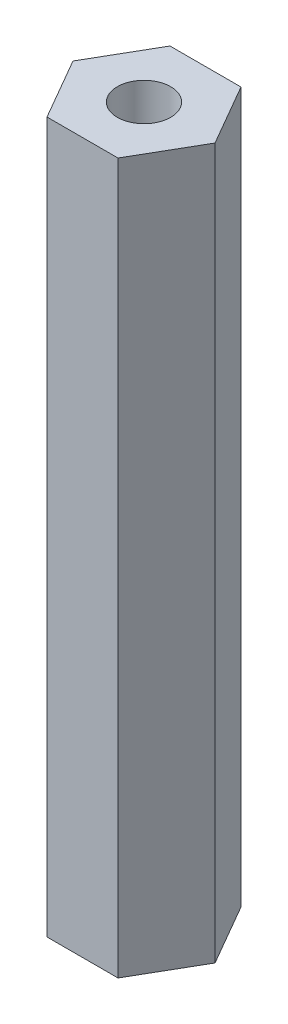
ISO-10303-21;
HEADER;
FILE_DESCRIPTION(('STEP AP214'),'2;1');
FILE_NAME('part.step','',(''),(''),'','','');
FILE_SCHEMA(('AUTOMOTIVE_DESIGN { 1 0 10303 214 1 1 1 1 }'));
ENDSEC;
DATA;
#1=APPLICATION_CONTEXT('core data for automotive mechanical design processes');
#2=APPLICATION_PROTOCOL_DEFINITION('international standard','automotive_design',2000,#1);
#3=PRODUCT_CONTEXT('',#1,'mechanical');
#4=PRODUCT('Part','Part','',(#3));
#5=PRODUCT_RELATED_PRODUCT_CATEGORY('part','',(#4));
#6=PRODUCT_DEFINITION_FORMATION('','',#4);
#7=PRODUCT_DEFINITION_CONTEXT('part definition',#1,'design');
#8=PRODUCT_DEFINITION('design','',#6,#7);
#9=PRODUCT_DEFINITION_SHAPE('','',#8);
#10=(LENGTH_UNIT() NAMED_UNIT(*) SI_UNIT(.MILLI.,.METRE.));
#11=(NAMED_UNIT(*) PLANE_ANGLE_UNIT() SI_UNIT($,.RADIAN.));
#12=(NAMED_UNIT(*) SI_UNIT($,.STERADIAN.) SOLID_ANGLE_UNIT());
#13=UNCERTAINTY_MEASURE_WITH_UNIT(LENGTH_MEASURE(1.E-05),#10,'distance_accuracy_value','');
#14=(GEOMETRIC_REPRESENTATION_CONTEXT(3) GLOBAL_UNCERTAINTY_ASSIGNED_CONTEXT((#13)) GLOBAL_UNIT_ASSIGNED_CONTEXT((#10,
#11,#12)) REPRESENTATION_CONTEXT('',''));
#15=CARTESIAN_POINT('',(0.,0.,0.));
#16=DIRECTION('',(0.,0.,1.));
#17=DIRECTION('',(1.,0.,0.));
#18=AXIS2_PLACEMENT_3D('',#15,#16,#17);
#19=CARTESIAN_POINT('',(-2.,40.,-3.46410161513776));
#20=DIRECTION('',(0.866025403784438,0.,0.5));
#21=DIRECTION('',(0.5,0.,-0.866025403784438));
#22=AXIS2_PLACEMENT_3D('',#19,#20,#21);
#23=PLANE('',#22);
#24=DIRECTION('',(-0.5,0.,0.866025403784438));
#25=VECTOR('',#24,1.);
#26=CARTESIAN_POINT('',(-2.,0.,-3.46410161513776));
#27=LINE('',#26,#25);
#28=CARTESIAN_POINT('',(-2.,0.,-3.46410161513776));
#29=VERTEX_POINT('',#28);
#30=CARTESIAN_POINT('',(-4.,0.,0.));
#31=VERTEX_POINT('',#30);
#32=EDGE_CURVE('E118',#29,#31,#27,.T.);
#33=ORIENTED_EDGE('',*,*,#32,.T.);
#34=DIRECTION('',(0.,-1.,0.));
#35=VECTOR('',#34,1.);
#36=CARTESIAN_POINT('',(-4.,40.,0.));
#37=LINE('',#36,#35);
#38=CARTESIAN_POINT('',(-4.,40.,0.));
#39=VERTEX_POINT('',#38);
#40=EDGE_CURVE('E11',#39,#31,#37,.T.);
#41=ORIENTED_EDGE('',*,*,#40,.F.);
#42=DIRECTION('',(-0.5,0.,0.866025403784438));
#43=VECTOR('',#42,1.);
#44=CARTESIAN_POINT('',(-2.,40.,-3.46410161513776));
#45=LINE('',#44,#43);
#46=CARTESIAN_POINT('',(-2.,40.,-3.46410161513776));
#47=VERTEX_POINT('',#46);
#48=EDGE_CURVE('E129',#47,#39,#45,.T.);
#49=ORIENTED_EDGE('',*,*,#48,.F.);
#50=DIRECTION('',(0.,-1.,0.));
#51=VECTOR('',#50,1.);
#52=CARTESIAN_POINT('',(-2.,40.,-3.46410161513776));
#53=LINE('',#52,#51);
#54=EDGE_CURVE('E114',#47,#29,#53,.T.);
#55=ORIENTED_EDGE('',*,*,#54,.T.);
#56=EDGE_LOOP('',(#33,#41,#49,#55));
#57=FACE_BOUND('',#56,.T.);
#58=ADVANCED_FACE('F34',(#57),#23,.F.);
#59=CARTESIAN_POINT('',(-4.,40.,0.));
#60=DIRECTION('',(0.866025403784438,0.,-0.5));
#61=DIRECTION('',(-0.5,0.,-0.866025403784439));
#62=AXIS2_PLACEMENT_3D('',#59,#60,#61);
#63=PLANE('',#62);
#64=DIRECTION('',(0.5,0.,0.866025403784439));
#65=VECTOR('',#64,1.);
#66=CARTESIAN_POINT('',(-4.,0.,0.));
#67=LINE('',#66,#65);
#68=CARTESIAN_POINT('',(-2.,0.,3.46410161513776));
#69=VERTEX_POINT('',#68);
#70=EDGE_CURVE('E121',#31,#69,#67,.T.);
#71=ORIENTED_EDGE('',*,*,#70,.T.);
#72=DIRECTION('',(0.,-1.,0.));
#73=VECTOR('',#72,1.);
#74=CARTESIAN_POINT('',(-2.,40.,3.46410161513776));
#75=LINE('',#74,#73);
#76=CARTESIAN_POINT('',(-2.,40.,3.46410161513776));
#77=VERTEX_POINT('',#76);
#78=EDGE_CURVE('E42',#77,#69,#75,.T.);
#79=ORIENTED_EDGE('',*,*,#78,.F.);
#80=DIRECTION('',(0.5,0.,0.866025403784439));
#81=VECTOR('',#80,1.);
#82=CARTESIAN_POINT('',(-4.,40.,0.));
#83=LINE('',#82,#81);
#84=EDGE_CURVE('E87',#39,#77,#83,.T.);
#85=ORIENTED_EDGE('',*,*,#84,.F.);
#86=ORIENTED_EDGE('',*,*,#40,.T.);
#87=EDGE_LOOP('',(#71,#79,#85,#86));
#88=FACE_BOUND('',#87,.T.);
#89=ADVANCED_FACE('F154',(#88),#63,.F.);
#90=CARTESIAN_POINT('',(-2.,40.,3.46410161513776));
#91=DIRECTION('',(0.,0.,-1.));
#92=DIRECTION('',(-1.,0.,0.));
#93=AXIS2_PLACEMENT_3D('',#90,#91,#92);
#94=PLANE('',#93);
#95=DIRECTION('',(1.,0.,0.));
#96=VECTOR('',#95,1.);
#97=CARTESIAN_POINT('',(-2.,0.,3.46410161513776));
#98=LINE('',#97,#96);
#99=CARTESIAN_POINT('',(2.,0.,3.46410161513776));
#100=VERTEX_POINT('',#99);
#101=EDGE_CURVE('E124',#69,#100,#98,.T.);
#102=ORIENTED_EDGE('',*,*,#101,.T.);
#103=DIRECTION('',(0.,-1.,0.));
#104=VECTOR('',#103,1.);
#105=CARTESIAN_POINT('',(2.,40.,3.46410161513776));
#106=LINE('',#105,#104);
#107=CARTESIAN_POINT('',(2.,40.,3.46410161513776));
#108=VERTEX_POINT('',#107);
#109=EDGE_CURVE('E109',#108,#100,#106,.T.);
#110=ORIENTED_EDGE('',*,*,#109,.F.);
#111=DIRECTION('',(1.,0.,0.));
#112=VECTOR('',#111,1.);
#113=CARTESIAN_POINT('',(-2.,40.,3.46410161513776));
#114=LINE('',#113,#112);
#115=EDGE_CURVE('E100',#77,#108,#114,.T.);
#116=ORIENTED_EDGE('',*,*,#115,.F.);
#117=ORIENTED_EDGE('',*,*,#78,.T.);
#118=EDGE_LOOP('',(#102,#110,#116,#117));
#119=FACE_BOUND('',#118,.T.);
#120=ADVANCED_FACE('F135',(#119),#94,.F.);
#121=CARTESIAN_POINT('',(2.,40.,3.46410161513776));
#122=DIRECTION('',(-0.866025403784438,0.,-0.5));
#123=DIRECTION('',(-0.5,0.,0.866025403784438));
#124=AXIS2_PLACEMENT_3D('',#121,#122,#123);
#125=PLANE('',#124);
#126=DIRECTION('',(0.5,0.,-0.866025403784438));
#127=VECTOR('',#126,1.);
#128=CARTESIAN_POINT('',(2.,0.,3.46410161513776));
#129=LINE('',#128,#127);
#130=CARTESIAN_POINT('',(4.,0.,0.));
#131=VERTEX_POINT('',#130);
#132=EDGE_CURVE('E108',#100,#131,#129,.T.);
#133=ORIENTED_EDGE('',*,*,#132,.T.);
#134=DIRECTION('',(0.,-1.,0.));
#135=VECTOR('',#134,1.);
#136=CARTESIAN_POINT('',(4.,40.,0.));
#137=LINE('',#136,#135);
#138=CARTESIAN_POINT('',(4.,40.,0.));
#139=VERTEX_POINT('',#138);
#140=EDGE_CURVE('E105',#139,#131,#137,.T.);
#141=ORIENTED_EDGE('',*,*,#140,.F.);
#142=DIRECTION('',(0.5,0.,-0.866025403784438));
#143=VECTOR('',#142,1.);
#144=CARTESIAN_POINT('',(2.,40.,3.46410161513776));
#145=LINE('',#144,#143);
#146=EDGE_CURVE('E94',#108,#139,#145,.T.);
#147=ORIENTED_EDGE('',*,*,#146,.F.);
#148=ORIENTED_EDGE('',*,*,#109,.T.);
#149=EDGE_LOOP('',(#133,#141,#147,#148));
#150=FACE_BOUND('',#149,.T.);
#151=ADVANCED_FACE('F106',(#150),#125,.F.);
#152=CARTESIAN_POINT('',(4.,40.,0.));
#153=DIRECTION('',(-0.866025403784439,0.,0.5));
#154=DIRECTION('',(0.5,0.,0.866025403784439));
#155=AXIS2_PLACEMENT_3D('',#152,#153,#154);
#156=PLANE('',#155);
#157=DIRECTION('',(-0.5,0.,-0.866025403784439));
#158=VECTOR('',#157,1.);
#159=CARTESIAN_POINT('',(4.,0.,0.));
#160=LINE('',#159,#158);
#161=CARTESIAN_POINT('',(2.,0.,-3.46410161513776));
#162=VERTEX_POINT('',#161);
#163=EDGE_CURVE('E73',#131,#162,#160,.T.);
#164=ORIENTED_EDGE('',*,*,#163,.T.);
#165=DIRECTION('',(0.,-1.,0.));
#166=VECTOR('',#165,1.);
#167=CARTESIAN_POINT('',(2.,40.,-3.46410161513776));
#168=LINE('',#167,#166);
#169=CARTESIAN_POINT('',(2.,40.,-3.46410161513776));
#170=VERTEX_POINT('',#169);
#171=EDGE_CURVE('E110',#170,#162,#168,.T.);
#172=ORIENTED_EDGE('',*,*,#171,.F.);
#173=DIRECTION('',(-0.5,0.,-0.866025403784439));
#174=VECTOR('',#173,1.);
#175=CARTESIAN_POINT('',(4.,40.,0.));
#176=LINE('',#175,#174);
#177=EDGE_CURVE('E98',#139,#170,#176,.T.);
#178=ORIENTED_EDGE('',*,*,#177,.F.);
#179=ORIENTED_EDGE('',*,*,#140,.T.);
#180=EDGE_LOOP('',(#164,#172,#178,#179));
#181=FACE_BOUND('',#180,.T.);
#182=ADVANCED_FACE('F112',(#181),#156,.F.);
#183=CARTESIAN_POINT('',(2.,40.,-3.46410161513776));
#184=DIRECTION('',(0.,0.,1.));
#185=DIRECTION('',(1.,0.,0.));
#186=AXIS2_PLACEMENT_3D('',#183,#184,#185);
#187=PLANE('',#186);
#188=DIRECTION('',(-1.,0.,0.));
#189=VECTOR('',#188,1.);
#190=CARTESIAN_POINT('',(2.,0.,-3.46410161513776));
#191=LINE('',#190,#189);
#192=EDGE_CURVE('E79',#162,#29,#191,.T.);
#193=ORIENTED_EDGE('',*,*,#192,.T.);
#194=ORIENTED_EDGE('',*,*,#54,.F.);
#195=DIRECTION('',(-1.,0.,0.));
#196=VECTOR('',#195,1.);
#197=CARTESIAN_POINT('',(2.,40.,-3.46410161513776));
#198=LINE('',#197,#196);
#199=EDGE_CURVE('E50',#170,#47,#198,.T.);
#200=ORIENTED_EDGE('',*,*,#199,.F.);
#201=ORIENTED_EDGE('',*,*,#171,.T.);
#202=EDGE_LOOP('',(#193,#194,#200,#201));
#203=FACE_BOUND('',#202,.T.);
#204=ADVANCED_FACE('F142',(#203),#187,.F.);
#205=CARTESIAN_POINT('',(0.,40.,0.));
#206=DIRECTION('',(0.,1.,0.));
#207=DIRECTION('',(0.,0.,1.));
#208=AXIS2_PLACEMENT_3D('',#205,#206,#207);
#209=PLANE('',#208);
#210=CARTESIAN_POINT('',(0.,40.,0.));
#211=DIRECTION('',(0.,1.,0.));
#212=DIRECTION('',(0.,0.,1.));
#213=AXIS2_PLACEMENT_3D('',#210,#211,#212);
#214=CIRCLE('',#213,1.5);
#215=CARTESIAN_POINT('',(0.,40.,1.5));
#216=VERTEX_POINT('',#215);
#217=EDGE_CURVE('E209',#216,#216,#214,.T.);
#218=ORIENTED_EDGE('',*,*,#217,.F.);
#219=EDGE_LOOP('',(#218));
#220=FACE_BOUND('',#219,.T.);
#221=ORIENTED_EDGE('',*,*,#48,.T.);
#222=ORIENTED_EDGE('',*,*,#84,.T.);
#223=ORIENTED_EDGE('',*,*,#115,.T.);
#224=ORIENTED_EDGE('',*,*,#146,.T.);
#225=ORIENTED_EDGE('',*,*,#177,.T.);
#226=ORIENTED_EDGE('',*,*,#199,.T.);
#227=EDGE_LOOP('',(#221,#222,#223,#224,#225,#226));
#228=FACE_BOUND('',#227,.T.);
#229=ADVANCED_FACE('F96',(#220,#228),#209,.T.);
#230=CARTESIAN_POINT('',(0.,0.,0.));
#231=DIRECTION('',(0.,1.,0.));
#232=DIRECTION('',(0.,0.,1.));
#233=AXIS2_PLACEMENT_3D('',#230,#231,#232);
#234=PLANE('',#233);
#235=CARTESIAN_POINT('',(0.,0.,0.));
#236=DIRECTION('',(0.,1.,0.));
#237=DIRECTION('',(0.,0.,1.));
#238=AXIS2_PLACEMENT_3D('',#235,#236,#237);
#239=CIRCLE('',#238,1.5);
#240=CARTESIAN_POINT('',(0.,0.,1.5));
#241=VERTEX_POINT('',#240);
#242=EDGE_CURVE('E122',#241,#241,#239,.T.);
#243=ORIENTED_EDGE('',*,*,#242,.T.);
#244=EDGE_LOOP('',(#243));
#245=FACE_BOUND('',#244,.T.);
#246=ORIENTED_EDGE('',*,*,#32,.F.);
#247=ORIENTED_EDGE('',*,*,#192,.F.);
#248=ORIENTED_EDGE('',*,*,#163,.F.);
#249=ORIENTED_EDGE('',*,*,#132,.F.);
#250=ORIENTED_EDGE('',*,*,#101,.F.);
#251=ORIENTED_EDGE('',*,*,#70,.F.);
#252=EDGE_LOOP('',(#246,#247,#248,#249,#250,#251));
#253=FACE_BOUND('',#252,.T.);
#254=ADVANCED_FACE('F138',(#245,#253),#234,.F.);
#255=CARTESIAN_POINT('',(0.,0.,0.));
#256=DIRECTION('',(0.,1.,0.));
#257=DIRECTION('',(0.,0.,1.));
#258=AXIS2_PLACEMENT_3D('',#255,#256,#257);
#259=CYLINDRICAL_SURFACE('',#258,1.5);
#260=ORIENTED_EDGE('',*,*,#242,.F.);
#261=EDGE_LOOP('',(#260));
#262=FACE_BOUND('',#261,.T.);
#263=ORIENTED_EDGE('',*,*,#217,.T.);
#264=EDGE_LOOP('',(#263));
#265=FACE_BOUND('',#264,.T.);
#266=ADVANCED_FACE('F191',(#262,#265),#259,.F.);
#267=CLOSED_SHELL('',(#58,#89,#120,#151,#182,#204,#229,#254,#266));
#268=MANIFOLD_SOLID_BREP('B2',#267);
#269=ADVANCED_BREP_SHAPE_REPRESENTATION('',(#18,#268),#14);
#270=SHAPE_DEFINITION_REPRESENTATION(#9,#269);
ENDSEC;
END-ISO-10303-21;
